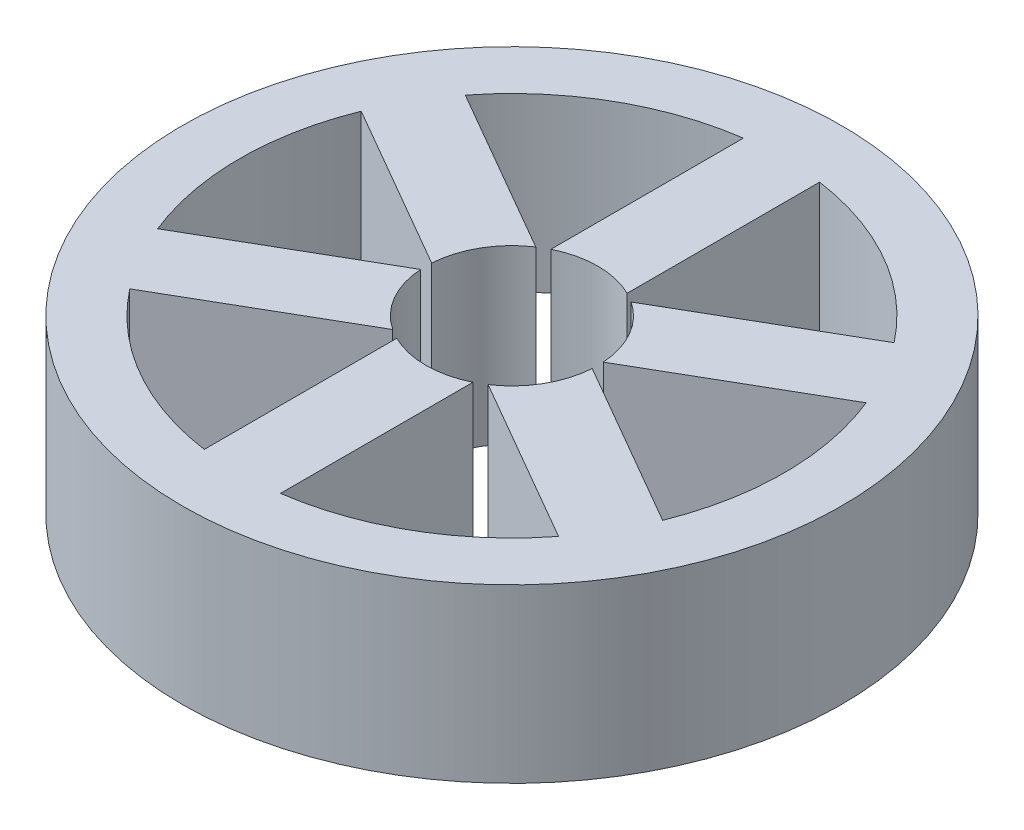
ISO-10303-21;
HEADER;
FILE_DESCRIPTION(('STEP AP214'),'2;1');
FILE_NAME('part.step','',(''),(''),'','','');
FILE_SCHEMA(('AUTOMOTIVE_DESIGN { 1 0 10303 214 1 1 1 1 }'));
ENDSEC;
DATA;
#1=APPLICATION_CONTEXT('core data for automotive mechanical design processes');
#2=APPLICATION_PROTOCOL_DEFINITION('international standard','automotive_design',2000,#1);
#3=PRODUCT_CONTEXT('',#1,'mechanical');
#4=PRODUCT('Part','Part','',(#3));
#5=PRODUCT_RELATED_PRODUCT_CATEGORY('part','',(#4));
#6=PRODUCT_DEFINITION_FORMATION('','',#4);
#7=PRODUCT_DEFINITION_CONTEXT('part definition',#1,'design');
#8=PRODUCT_DEFINITION('design','',#6,#7);
#9=PRODUCT_DEFINITION_SHAPE('','',#8);
#10=(LENGTH_UNIT() NAMED_UNIT(*) SI_UNIT(.MILLI.,.METRE.));
#11=(NAMED_UNIT(*) PLANE_ANGLE_UNIT() SI_UNIT($,.RADIAN.));
#12=(NAMED_UNIT(*) SI_UNIT($,.STERADIAN.) SOLID_ANGLE_UNIT());
#13=UNCERTAINTY_MEASURE_WITH_UNIT(LENGTH_MEASURE(1.E-05),#10,'distance_accuracy_value','');
#14=(GEOMETRIC_REPRESENTATION_CONTEXT(3) GLOBAL_UNCERTAINTY_ASSIGNED_CONTEXT((#13)) GLOBAL_UNIT_ASSIGNED_CONTEXT((#10,
#11,#12)) REPRESENTATION_CONTEXT('',''));
#15=CARTESIAN_POINT('',(0.,0.,0.));
#16=DIRECTION('',(0.,0.,1.));
#17=DIRECTION('',(1.,0.,0.));
#18=AXIS2_PLACEMENT_3D('',#15,#16,#17);
#19=CARTESIAN_POINT('',(0.,3.,0.));
#20=DIRECTION('',(0.,-1.,0.));
#21=DIRECTION('',(0.,0.,-1.));
#22=AXIS2_PLACEMENT_3D('',#19,#20,#21);
#23=CYLINDRICAL_SURFACE('',#22,4.75);
#24=CARTESIAN_POINT('',(0.,0.,0.));
#25=DIRECTION('',(0.,1.,0.));
#26=DIRECTION('',(0.,0.,1.));
#27=AXIS2_PLACEMENT_3D('',#24,#25,#26);
#28=CIRCLE('',#27,4.75);
#29=CARTESIAN_POINT('',(-3.74081986253042,0.,2.92724559203664));
#30=VERTEX_POINT('',#29);
#31=CARTESIAN_POINT('',(-0.664659114554616,0.,4.70326782795106));
#32=VERTEX_POINT('',#31);
#33=EDGE_CURVE('E313',#30,#32,#28,.T.);
#34=ORIENTED_EDGE('',*,*,#33,.F.);
#35=DIRECTION('',(0.,-1.,0.));
#36=VECTOR('',#35,1.);
#37=CARTESIAN_POINT('',(-3.74081986253042,3.,2.92724559203664));
#38=LINE('',#37,#36);
#39=CARTESIAN_POINT('',(-3.74081986253042,3.,2.92724559203664));
#40=VERTEX_POINT('',#39);
#41=EDGE_CURVE('E11',#40,#30,#38,.T.);
#42=ORIENTED_EDGE('',*,*,#41,.F.);
#43=CARTESIAN_POINT('',(0.,3.,0.));
#44=DIRECTION('',(0.,1.,0.));
#45=DIRECTION('',(0.,0.,1.));
#46=AXIS2_PLACEMENT_3D('',#43,#44,#45);
#47=CIRCLE('',#46,4.75);
#48=CARTESIAN_POINT('',(-0.664659114554616,3.,4.70326782795106));
#49=VERTEX_POINT('',#48);
#50=EDGE_CURVE('E256',#40,#49,#47,.T.);
#51=ORIENTED_EDGE('',*,*,#50,.T.);
#52=DIRECTION('',(0.,-1.,0.));
#53=VECTOR('',#52,1.);
#54=CARTESIAN_POINT('',(-0.664659114554616,3.,4.70326782795106));
#55=LINE('',#54,#53);
#56=EDGE_CURVE('E142',#49,#32,#55,.T.);
#57=ORIENTED_EDGE('',*,*,#56,.T.);
#58=EDGE_LOOP('',(#34,#42,#51,#57));
#59=FACE_BOUND('',#58,.T.);
#60=ADVANCED_FACE('F43',(#59),#23,.F.);
#61=CARTESIAN_POINT('',(0.332329557277286,3.,0.575611678061143));
#62=DIRECTION('',(0.499999999999992,0.,0.866025403784443));
#63=DIRECTION('',(0.866025403784443,0.,-0.499999999999992));
#64=AXIS2_PLACEMENT_3D('',#61,#62,#63);
#65=PLANE('',#64);
#66=DIRECTION('',(-0.866025403784443,0.,0.499999999999992));
#67=VECTOR('',#66,1.);
#68=CARTESIAN_POINT('',(0.332329557277286,0.,0.575611678061143));
#69=LINE('',#68,#67);
#70=CARTESIAN_POINT('',(-0.832218078536575,0.,1.2479635690824));
#71=VERTEX_POINT('',#70);
#72=EDGE_CURVE('E317',#71,#30,#69,.T.);
#73=ORIENTED_EDGE('',*,*,#72,.F.);
#74=DIRECTION('',(0.,-1.,0.));
#75=VECTOR('',#74,1.);
#76=CARTESIAN_POINT('',(-0.832218078536575,3.,1.2479635690824));
#77=LINE('',#76,#75);
#78=CARTESIAN_POINT('',(-0.832218078536575,3.,1.2479635690824));
#79=VERTEX_POINT('',#78);
#80=EDGE_CURVE('E52',#79,#71,#77,.T.);
#81=ORIENTED_EDGE('',*,*,#80,.F.);
#82=DIRECTION('',(-0.866025403784443,0.,0.499999999999992));
#83=VECTOR('',#82,1.);
#84=CARTESIAN_POINT('',(0.332329557277286,3.,0.575611678061143));
#85=LINE('',#84,#83);
#86=EDGE_CURVE('E248',#79,#40,#85,.T.);
#87=ORIENTED_EDGE('',*,*,#86,.T.);
#88=ORIENTED_EDGE('',*,*,#41,.T.);
#89=EDGE_LOOP('',(#73,#81,#87,#88));
#90=FACE_BOUND('',#89,.T.);
#91=ADVANCED_FACE('F460',(#90),#65,.T.);
#92=CARTESIAN_POINT('',(0.,3.,0.));
#93=DIRECTION('',(0.,-1.,0.));
#94=DIRECTION('',(0.,0.,-1.));
#95=AXIS2_PLACEMENT_3D('',#92,#93,#94);
#96=CYLINDRICAL_SURFACE('',#95,1.5);
#97=CARTESIAN_POINT('',(0.,0.,0.));
#98=DIRECTION('',(0.,1.,0.));
#99=DIRECTION('',(0.,0.,1.));
#100=AXIS2_PLACEMENT_3D('',#97,#98,#99);
#101=CIRCLE('',#100,1.5);
#102=CARTESIAN_POINT('',(-1.49687719309115,0.,0.0967402129601177));
#103=VERTEX_POINT('',#102);
#104=EDGE_CURVE('E321',#103,#71,#101,.T.);
#105=ORIENTED_EDGE('',*,*,#104,.F.);
#106=DIRECTION('',(0.,-1.,0.));
#107=VECTOR('',#106,1.);
#108=CARTESIAN_POINT('',(-1.49687719309115,3.,0.0967402129601177));
#109=LINE('',#108,#107);
#110=CARTESIAN_POINT('',(-1.49687719309115,3.,0.0967402129601177));
#111=VERTEX_POINT('',#110);
#112=EDGE_CURVE('E452',#111,#103,#109,.T.);
#113=ORIENTED_EDGE('',*,*,#112,.F.);
#114=CARTESIAN_POINT('',(0.,3.,0.));
#115=DIRECTION('',(0.,1.,0.));
#116=DIRECTION('',(0.,0.,1.));
#117=AXIS2_PLACEMENT_3D('',#114,#115,#116);
#118=CIRCLE('',#117,1.5);
#119=EDGE_CURVE('E234',#111,#79,#118,.T.);
#120=ORIENTED_EDGE('',*,*,#119,.T.);
#121=ORIENTED_EDGE('',*,*,#80,.T.);
#122=EDGE_LOOP('',(#105,#113,#120,#121));
#123=FACE_BOUND('',#122,.T.);
#124=ADVANCED_FACE('F457',(#123),#96,.F.);
#125=CARTESIAN_POINT('',(-0.332329557277286,3.,-0.575611678061143));
#126=DIRECTION('',(0.499999999999992,0.,0.866025403784443));
#127=DIRECTION('',(0.866025403784443,0.,-0.499999999999992));
#128=AXIS2_PLACEMENT_3D('',#125,#126,#127);
#129=PLANE('',#128);
#130=DIRECTION('',(-0.866025403784443,0.,0.499999999999992));
#131=VECTOR('',#130,1.);
#132=CARTESIAN_POINT('',(-0.332329557277286,0.,-0.575611678061143));
#133=LINE('',#132,#131);
#134=CARTESIAN_POINT('',(-4.40547897708499,0.,1.77602223591435));
#135=VERTEX_POINT('',#134);
#136=EDGE_CURVE('E325',#103,#135,#133,.T.);
#137=ORIENTED_EDGE('',*,*,#136,.T.);
#138=DIRECTION('',(0.,-1.,0.));
#139=VECTOR('',#138,1.);
#140=CARTESIAN_POINT('',(-4.40547897708499,3.,1.77602223591435));
#141=LINE('',#140,#139);
#142=CARTESIAN_POINT('',(-4.40547897708499,3.,1.77602223591435));
#143=VERTEX_POINT('',#142);
#144=EDGE_CURVE('E449',#143,#135,#141,.T.);
#145=ORIENTED_EDGE('',*,*,#144,.F.);
#146=DIRECTION('',(-0.866025403784443,0.,0.499999999999992));
#147=VECTOR('',#146,1.);
#148=CARTESIAN_POINT('',(-0.332329557277286,3.,-0.575611678061143));
#149=LINE('',#148,#147);
#150=EDGE_CURVE('E247',#111,#143,#149,.T.);
#151=ORIENTED_EDGE('',*,*,#150,.F.);
#152=ORIENTED_EDGE('',*,*,#112,.T.);
#153=EDGE_LOOP('',(#137,#145,#151,#152));
#154=FACE_BOUND('',#153,.T.);
#155=ADVANCED_FACE('F468',(#154),#129,.F.);
#156=CARTESIAN_POINT('',(0.,3.,0.));
#157=DIRECTION('',(0.,-1.,0.));
#158=DIRECTION('',(0.,0.,-1.));
#159=AXIS2_PLACEMENT_3D('',#156,#157,#158);
#160=CYLINDRICAL_SURFACE('',#159,4.75);
#161=CARTESIAN_POINT('',(0.,0.,0.));
#162=DIRECTION('',(0.,1.,0.));
#163=DIRECTION('',(0.,0.,1.));
#164=AXIS2_PLACEMENT_3D('',#161,#162,#163);
#165=CIRCLE('',#164,4.75);
#166=CARTESIAN_POINT('',(-4.40547897708495,0.,-1.77602223591444));
#167=VERTEX_POINT('',#166);
#168=EDGE_CURVE('E331',#167,#135,#165,.T.);
#169=ORIENTED_EDGE('',*,*,#168,.F.);
#170=DIRECTION('',(0.,-1.,0.));
#171=VECTOR('',#170,1.);
#172=CARTESIAN_POINT('',(-4.40547897708495,3.,-1.77602223591444));
#173=LINE('',#172,#171);
#174=CARTESIAN_POINT('',(-4.40547897708495,3.,-1.77602223591444));
#175=VERTEX_POINT('',#174);
#176=EDGE_CURVE('E446',#175,#167,#173,.T.);
#177=ORIENTED_EDGE('',*,*,#176,.F.);
#178=CARTESIAN_POINT('',(0.,3.,0.));
#179=DIRECTION('',(0.,1.,0.));
#180=DIRECTION('',(0.,0.,1.));
#181=AXIS2_PLACEMENT_3D('',#178,#179,#180);
#182=CIRCLE('',#181,4.75);
#183=EDGE_CURVE('E254',#175,#143,#182,.T.);
#184=ORIENTED_EDGE('',*,*,#183,.T.);
#185=ORIENTED_EDGE('',*,*,#144,.T.);
#186=EDGE_LOOP('',(#169,#177,#184,#185));
#187=FACE_BOUND('',#186,.T.);
#188=ADVANCED_FACE('F492',(#187),#160,.F.);
#189=CARTESIAN_POINT('',(-0.332329557277298,3.,0.575611678061136));
#190=DIRECTION('',(-0.50000000000001,0.,0.866025403784433));
#191=DIRECTION('',(0.866025403784433,0.,0.50000000000001));
#192=AXIS2_PLACEMENT_3D('',#189,#190,#191);
#193=PLANE('',#192);
#194=DIRECTION('',(-0.866025403784433,0.,-0.50000000000001));
#195=VECTOR('',#194,1.);
#196=CARTESIAN_POINT('',(-0.332329557277298,0.,0.575611678061136));
#197=LINE('',#196,#195);
#198=CARTESIAN_POINT('',(-1.49687719309115,0.,-0.0967402129601493));
#199=VERTEX_POINT('',#198);
#200=EDGE_CURVE('E335',#199,#167,#197,.T.);
#201=ORIENTED_EDGE('',*,*,#200,.F.);
#202=DIRECTION('',(0.,-1.,0.));
#203=VECTOR('',#202,1.);
#204=CARTESIAN_POINT('',(-1.49687719309115,3.,-0.0967402129601493));
#205=LINE('',#204,#203);
#206=CARTESIAN_POINT('',(-1.49687719309115,3.,-0.0967402129601493));
#207=VERTEX_POINT('',#206);
#208=EDGE_CURVE('E443',#207,#199,#205,.T.);
#209=ORIENTED_EDGE('',*,*,#208,.F.);
#210=DIRECTION('',(-0.866025403784433,0.,-0.50000000000001));
#211=VECTOR('',#210,1.);
#212=CARTESIAN_POINT('',(-0.332329557277298,3.,0.575611678061136));
#213=LINE('',#212,#211);
#214=EDGE_CURVE('E260',#207,#175,#213,.T.);
#215=ORIENTED_EDGE('',*,*,#214,.T.);
#216=ORIENTED_EDGE('',*,*,#176,.T.);
#217=EDGE_LOOP('',(#201,#209,#215,#216));
#218=FACE_BOUND('',#217,.T.);
#219=ADVANCED_FACE('F490',(#218),#193,.T.);
#220=CARTESIAN_POINT('',(-0.832218078536549,0.,-1.24796356908242));
#221=VERTEX_POINT('',#220);
#222=EDGE_CURVE('E327',#221,#199,#101,.T.);
#223=ORIENTED_EDGE('',*,*,#222,.F.);
#224=DIRECTION('',(0.,-1.,0.));
#225=VECTOR('',#224,1.);
#226=CARTESIAN_POINT('',(-0.832218078536549,3.,-1.24796356908242));
#227=LINE('',#226,#225);
#228=CARTESIAN_POINT('',(-0.832218078536549,3.,-1.24796356908242));
#229=VERTEX_POINT('',#228);
#230=EDGE_CURVE('E440',#229,#221,#227,.T.);
#231=ORIENTED_EDGE('',*,*,#230,.F.);
#232=EDGE_CURVE('E249',#229,#207,#118,.T.);
#233=ORIENTED_EDGE('',*,*,#232,.T.);
#234=ORIENTED_EDGE('',*,*,#208,.T.);
#235=EDGE_LOOP('',(#223,#231,#233,#234));
#236=FACE_BOUND('',#235,.T.);
#237=ADVANCED_FACE('F486',(#236),#96,.F.);
#238=CARTESIAN_POINT('',(0.332329557277298,3.,-0.575611678061136));
#239=DIRECTION('',(-0.50000000000001,0.,0.866025403784433));
#240=DIRECTION('',(0.866025403784433,0.,0.50000000000001));
#241=AXIS2_PLACEMENT_3D('',#238,#239,#240);
#242=PLANE('',#241);
#243=DIRECTION('',(-0.866025403784433,0.,-0.50000000000001));
#244=VECTOR('',#243,1.);
#245=CARTESIAN_POINT('',(0.332329557277298,0.,-0.575611678061136));
#246=LINE('',#245,#244);
#247=CARTESIAN_POINT('',(-3.74081986253036,0.,-2.92724559203672));
#248=VERTEX_POINT('',#247);
#249=EDGE_CURVE('E339',#221,#248,#246,.T.);
#250=ORIENTED_EDGE('',*,*,#249,.T.);
#251=DIRECTION('',(0.,-1.,0.));
#252=VECTOR('',#251,1.);
#253=CARTESIAN_POINT('',(-3.74081986253036,3.,-2.92724559203672));
#254=LINE('',#253,#252);
#255=CARTESIAN_POINT('',(-3.74081986253036,3.,-2.92724559203672));
#256=VERTEX_POINT('',#255);
#257=EDGE_CURVE('E437',#256,#248,#254,.T.);
#258=ORIENTED_EDGE('',*,*,#257,.F.);
#259=DIRECTION('',(-0.866025403784433,0.,-0.50000000000001));
#260=VECTOR('',#259,1.);
#261=CARTESIAN_POINT('',(0.332329557277298,3.,-0.575611678061136));
#262=LINE('',#261,#260);
#263=EDGE_CURVE('E259',#229,#256,#262,.T.);
#264=ORIENTED_EDGE('',*,*,#263,.F.);
#265=ORIENTED_EDGE('',*,*,#230,.T.);
#266=EDGE_LOOP('',(#250,#258,#264,#265));
#267=FACE_BOUND('',#266,.T.);
#268=ADVANCED_FACE('F571',(#267),#242,.F.);
#269=CARTESIAN_POINT('',(0.,3.,0.));
#270=DIRECTION('',(0.,-1.,0.));
#271=DIRECTION('',(0.,0.,-1.));
#272=AXIS2_PLACEMENT_3D('',#269,#270,#271);
#273=CYLINDRICAL_SURFACE('',#272,4.75);
#274=CARTESIAN_POINT('',(0.,0.,0.));
#275=DIRECTION('',(0.,1.,0.));
#276=DIRECTION('',(0.,0.,1.));
#277=AXIS2_PLACEMENT_3D('',#274,#275,#276);
#278=CIRCLE('',#277,4.75);
#279=CARTESIAN_POINT('',(-0.664659114554583,0.,-4.70326782795106));
#280=VERTEX_POINT('',#279);
#281=EDGE_CURVE('E343',#280,#248,#278,.T.);
#282=ORIENTED_EDGE('',*,*,#281,.F.);
#283=DIRECTION('',(0.,-1.,0.));
#284=VECTOR('',#283,1.);
#285=CARTESIAN_POINT('',(-0.664659114554583,3.,-4.70326782795106));
#286=LINE('',#285,#284);
#287=CARTESIAN_POINT('',(-0.664659114554583,3.,-4.70326782795106));
#288=VERTEX_POINT('',#287);
#289=EDGE_CURVE('E434',#288,#280,#286,.T.);
#290=ORIENTED_EDGE('',*,*,#289,.F.);
#291=CARTESIAN_POINT('',(0.,3.,0.));
#292=DIRECTION('',(0.,1.,0.));
#293=DIRECTION('',(0.,0.,1.));
#294=AXIS2_PLACEMENT_3D('',#291,#292,#293);
#295=CIRCLE('',#294,4.75);
#296=EDGE_CURVE('E266',#288,#256,#295,.T.);
#297=ORIENTED_EDGE('',*,*,#296,.T.);
#298=ORIENTED_EDGE('',*,*,#257,.T.);
#299=EDGE_LOOP('',(#282,#290,#297,#298));
#300=FACE_BOUND('',#299,.T.);
#301=ADVANCED_FACE('F501',(#300),#273,.F.);
#302=CARTESIAN_POINT('',(-0.664659114554583,3.,0.));
#303=DIRECTION('',(-1.,0.,0.));
#304=DIRECTION('',(0.,0.,1.));
#305=AXIS2_PLACEMENT_3D('',#302,#303,#304);
#306=PLANE('',#305);
#307=DIRECTION('',(0.,0.,-1.));
#308=VECTOR('',#307,1.);
#309=CARTESIAN_POINT('',(-0.664659114554583,0.,0.));
#310=LINE('',#309,#308);
#311=CARTESIAN_POINT('',(-0.664659114554583,0.,-1.34470378204254));
#312=VERTEX_POINT('',#311);
#313=EDGE_CURVE('E347',#312,#280,#310,.T.);
#314=ORIENTED_EDGE('',*,*,#313,.F.);
#315=DIRECTION('',(0.,-1.,0.));
#316=VECTOR('',#315,1.);
#317=CARTESIAN_POINT('',(-0.664659114554583,3.,-1.34470378204254));
#318=LINE('',#317,#316);
#319=CARTESIAN_POINT('',(-0.664659114554583,3.,-1.34470378204254));
#320=VERTEX_POINT('',#319);
#321=EDGE_CURVE('E431',#320,#312,#318,.T.);
#322=ORIENTED_EDGE('',*,*,#321,.F.);
#323=DIRECTION('',(0.,0.,-1.));
#324=VECTOR('',#323,1.);
#325=CARTESIAN_POINT('',(-0.664659114554583,3.,0.));
#326=LINE('',#325,#324);
#327=EDGE_CURVE('E273',#320,#288,#326,.T.);
#328=ORIENTED_EDGE('',*,*,#327,.T.);
#329=ORIENTED_EDGE('',*,*,#289,.T.);
#330=EDGE_LOOP('',(#314,#322,#328,#329));
#331=FACE_BOUND('',#330,.T.);
#332=ADVANCED_FACE('F506',(#331),#306,.T.);
#333=CARTESIAN_POINT('',(0.664659114554583,0.,-1.34470378204254));
#334=VERTEX_POINT('',#333);
#335=EDGE_CURVE('E351',#334,#312,#101,.T.);
#336=ORIENTED_EDGE('',*,*,#335,.F.);
#337=DIRECTION('',(0.,-1.,0.));
#338=VECTOR('',#337,1.);
#339=CARTESIAN_POINT('',(0.664659114554583,3.,-1.34470378204254));
#340=LINE('',#339,#338);
#341=CARTESIAN_POINT('',(0.664659114554583,3.,-1.34470378204254));
#342=VERTEX_POINT('',#341);
#343=EDGE_CURVE('E428',#342,#334,#340,.T.);
#344=ORIENTED_EDGE('',*,*,#343,.F.);
#345=EDGE_CURVE('E261',#342,#320,#118,.T.);
#346=ORIENTED_EDGE('',*,*,#345,.T.);
#347=ORIENTED_EDGE('',*,*,#321,.T.);
#348=EDGE_LOOP('',(#336,#344,#346,#347));
#349=FACE_BOUND('',#348,.T.);
#350=ADVANCED_FACE('F508',(#349),#96,.F.);
#351=CARTESIAN_POINT('',(0.664659114554583,3.,0.));
#352=DIRECTION('',(-1.,0.,0.));
#353=DIRECTION('',(0.,0.,1.));
#354=AXIS2_PLACEMENT_3D('',#351,#352,#353);
#355=PLANE('',#354);
#356=DIRECTION('',(0.,0.,-1.));
#357=VECTOR('',#356,1.);
#358=CARTESIAN_POINT('',(0.664659114554583,0.,0.));
#359=LINE('',#358,#357);
#360=CARTESIAN_POINT('',(0.664659114554583,0.,-4.70326782795106));
#361=VERTEX_POINT('',#360);
#362=EDGE_CURVE('E352',#334,#361,#359,.T.);
#363=ORIENTED_EDGE('',*,*,#362,.T.);
#364=DIRECTION('',(0.,-1.,0.));
#365=VECTOR('',#364,1.);
#366=CARTESIAN_POINT('',(0.664659114554583,3.,-4.70326782795106));
#367=LINE('',#366,#365);
#368=CARTESIAN_POINT('',(0.664659114554583,3.,-4.70326782795106));
#369=VERTEX_POINT('',#368);
#370=EDGE_CURVE('E425',#369,#361,#367,.T.);
#371=ORIENTED_EDGE('',*,*,#370,.F.);
#372=DIRECTION('',(0.,0.,-1.));
#373=VECTOR('',#372,1.);
#374=CARTESIAN_POINT('',(0.664659114554583,3.,0.));
#375=LINE('',#374,#373);
#376=EDGE_CURVE('E272',#342,#369,#375,.T.);
#377=ORIENTED_EDGE('',*,*,#376,.F.);
#378=ORIENTED_EDGE('',*,*,#343,.T.);
#379=EDGE_LOOP('',(#363,#371,#377,#378));
#380=FACE_BOUND('',#379,.T.);
#381=ADVANCED_FACE('F514',(#380),#355,.F.);
#382=CARTESIAN_POINT('',(0.,3.,0.));
#383=DIRECTION('',(0.,-1.,0.));
#384=DIRECTION('',(0.,0.,-1.));
#385=AXIS2_PLACEMENT_3D('',#382,#383,#384);
#386=CYLINDRICAL_SURFACE('',#385,4.75);
#387=CARTESIAN_POINT('',(0.,0.,0.));
#388=DIRECTION('',(0.,1.,0.));
#389=DIRECTION('',(0.,0.,1.));
#390=AXIS2_PLACEMENT_3D('',#387,#388,#389);
#391=CIRCLE('',#390,4.75);
#392=CARTESIAN_POINT('',(3.7408198625304,0.,-2.92724559203666));
#393=VERTEX_POINT('',#392);
#394=EDGE_CURVE('E356',#393,#361,#391,.T.);
#395=ORIENTED_EDGE('',*,*,#394,.F.);
#396=DIRECTION('',(0.,-1.,0.));
#397=VECTOR('',#396,1.);
#398=CARTESIAN_POINT('',(3.7408198625304,3.,-2.92724559203666));
#399=LINE('',#398,#397);
#400=CARTESIAN_POINT('',(3.7408198625304,3.,-2.92724559203666));
#401=VERTEX_POINT('',#400);
#402=EDGE_CURVE('E422',#401,#393,#399,.T.);
#403=ORIENTED_EDGE('',*,*,#402,.F.);
#404=CARTESIAN_POINT('',(0.,3.,0.));
#405=DIRECTION('',(0.,1.,0.));
#406=DIRECTION('',(0.,0.,1.));
#407=AXIS2_PLACEMENT_3D('',#404,#405,#406);
#408=CIRCLE('',#407,4.75);
#409=EDGE_CURVE('E278',#401,#369,#408,.T.);
#410=ORIENTED_EDGE('',*,*,#409,.T.);
#411=ORIENTED_EDGE('',*,*,#370,.T.);
#412=EDGE_LOOP('',(#395,#403,#410,#411));
#413=FACE_BOUND('',#412,.T.);
#414=ADVANCED_FACE('F517',(#413),#386,.F.);
#415=CARTESIAN_POINT('',(-0.33232955727729,3.,-0.575611678061141));
#416=DIRECTION('',(-0.499999999999998,0.,-0.86602540378444));
#417=DIRECTION('',(-0.86602540378444,0.,0.499999999999998));
#418=AXIS2_PLACEMENT_3D('',#415,#416,#417);
#419=PLANE('',#418);
#420=DIRECTION('',(0.86602540378444,0.,-0.499999999999998));
#421=VECTOR('',#420,1.);
#422=CARTESIAN_POINT('',(-0.33232955727729,0.,-0.575611678061141));
#423=LINE('',#422,#421);
#424=CARTESIAN_POINT('',(0.832218078536567,0.,-1.24796356908241));
#425=VERTEX_POINT('',#424);
#426=EDGE_CURVE('E360',#425,#393,#423,.T.);
#427=ORIENTED_EDGE('',*,*,#426,.F.);
#428=DIRECTION('',(0.,-1.,0.));
#429=VECTOR('',#428,1.);
#430=CARTESIAN_POINT('',(0.832218078536567,3.,-1.24796356908241));
#431=LINE('',#430,#429);
#432=CARTESIAN_POINT('',(0.832218078536567,3.,-1.24796356908241));
#433=VERTEX_POINT('',#432);
#434=EDGE_CURVE('E419',#433,#425,#431,.T.);
#435=ORIENTED_EDGE('',*,*,#434,.F.);
#436=DIRECTION('',(0.86602540378444,0.,-0.499999999999998));
#437=VECTOR('',#436,1.);
#438=CARTESIAN_POINT('',(-0.33232955727729,3.,-0.575611678061141));
#439=LINE('',#438,#437);
#440=EDGE_CURVE('E285',#433,#401,#439,.T.);
#441=ORIENTED_EDGE('',*,*,#440,.T.);
#442=ORIENTED_EDGE('',*,*,#402,.T.);
#443=EDGE_LOOP('',(#427,#435,#441,#442));
#444=FACE_BOUND('',#443,.T.);
#445=ADVANCED_FACE('F519',(#444),#419,.T.);
#446=CARTESIAN_POINT('',(1.49687719309115,0.,-0.0967402129601286));
#447=VERTEX_POINT('',#446);
#448=EDGE_CURVE('E364',#447,#425,#101,.T.);
#449=ORIENTED_EDGE('',*,*,#448,.F.);
#450=DIRECTION('',(0.,-1.,0.));
#451=VECTOR('',#450,1.);
#452=CARTESIAN_POINT('',(1.49687719309115,3.,-0.0967402129601286));
#453=LINE('',#452,#451);
#454=CARTESIAN_POINT('',(1.49687719309115,3.,-0.0967402129601286));
#455=VERTEX_POINT('',#454);
#456=EDGE_CURVE('E416',#455,#447,#453,.T.);
#457=ORIENTED_EDGE('',*,*,#456,.F.);
#458=EDGE_CURVE('E244',#455,#433,#118,.T.);
#459=ORIENTED_EDGE('',*,*,#458,.T.);
#460=ORIENTED_EDGE('',*,*,#434,.T.);
#461=EDGE_LOOP('',(#449,#457,#459,#460));
#462=FACE_BOUND('',#461,.T.);
#463=ADVANCED_FACE('F522',(#462),#96,.F.);
#464=CARTESIAN_POINT('',(0.33232955727729,3.,0.57561167806114));
#465=DIRECTION('',(-0.499999999999998,0.,-0.86602540378444));
#466=DIRECTION('',(-0.86602540378444,0.,0.499999999999998));
#467=AXIS2_PLACEMENT_3D('',#464,#465,#466);
#468=PLANE('',#467);
#469=DIRECTION('',(0.86602540378444,0.,-0.499999999999998));
#470=VECTOR('',#469,1.);
#471=CARTESIAN_POINT('',(0.33232955727729,0.,0.57561167806114));
#472=LINE('',#471,#470);
#473=CARTESIAN_POINT('',(4.40547897708497,0.,-1.77602223591438));
#474=VERTEX_POINT('',#473);
#475=EDGE_CURVE('E365',#447,#474,#472,.T.);
#476=ORIENTED_EDGE('',*,*,#475,.T.);
#477=DIRECTION('',(0.,-1.,0.));
#478=VECTOR('',#477,1.);
#479=CARTESIAN_POINT('',(4.40547897708497,3.,-1.77602223591438));
#480=LINE('',#479,#478);
#481=CARTESIAN_POINT('',(4.40547897708497,3.,-1.77602223591438));
#482=VERTEX_POINT('',#481);
#483=EDGE_CURVE('E413',#482,#474,#480,.T.);
#484=ORIENTED_EDGE('',*,*,#483,.F.);
#485=DIRECTION('',(0.86602540378444,0.,-0.499999999999998));
#486=VECTOR('',#485,1.);
#487=CARTESIAN_POINT('',(0.33232955727729,3.,0.57561167806114));
#488=LINE('',#487,#486);
#489=EDGE_CURVE('E284',#455,#482,#488,.T.);
#490=ORIENTED_EDGE('',*,*,#489,.F.);
#491=ORIENTED_EDGE('',*,*,#456,.T.);
#492=EDGE_LOOP('',(#476,#484,#490,#491));
#493=FACE_BOUND('',#492,.T.);
#494=ADVANCED_FACE('F526',(#493),#468,.F.);
#495=CARTESIAN_POINT('',(0.,3.,0.));
#496=DIRECTION('',(0.,-1.,0.));
#497=DIRECTION('',(0.,0.,-1.));
#498=AXIS2_PLACEMENT_3D('',#495,#496,#497);
#499=CYLINDRICAL_SURFACE('',#498,4.75);
#500=CARTESIAN_POINT('',(0.,0.,0.));
#501=DIRECTION('',(0.,1.,0.));
#502=DIRECTION('',(0.,0.,1.));
#503=AXIS2_PLACEMENT_3D('',#500,#501,#502);
#504=CIRCLE('',#503,4.75);
#505=CARTESIAN_POINT('',(4.40547897708496,0.,1.77602223591441));
#506=VERTEX_POINT('',#505);
#507=EDGE_CURVE('E369',#506,#474,#504,.T.);
#508=ORIENTED_EDGE('',*,*,#507,.F.);
#509=DIRECTION('',(0.,-1.,0.));
#510=VECTOR('',#509,1.);
#511=CARTESIAN_POINT('',(4.40547897708496,3.,1.77602223591441));
#512=LINE('',#511,#510);
#513=CARTESIAN_POINT('',(4.40547897708496,3.,1.77602223591441));
#514=VERTEX_POINT('',#513);
#515=EDGE_CURVE('E410',#514,#506,#512,.T.);
#516=ORIENTED_EDGE('',*,*,#515,.F.);
#517=CARTESIAN_POINT('',(0.,3.,0.));
#518=DIRECTION('',(0.,1.,0.));
#519=DIRECTION('',(0.,0.,1.));
#520=AXIS2_PLACEMENT_3D('',#517,#518,#519);
#521=CIRCLE('',#520,4.75);
#522=EDGE_CURVE('E290',#514,#482,#521,.T.);
#523=ORIENTED_EDGE('',*,*,#522,.T.);
#524=ORIENTED_EDGE('',*,*,#483,.T.);
#525=EDGE_LOOP('',(#508,#516,#523,#524));
#526=FACE_BOUND('',#525,.T.);
#527=ADVANCED_FACE('F587',(#526),#499,.F.);
#528=CARTESIAN_POINT('',(0.332329557277294,3.,-0.575611678061139));
#529=DIRECTION('',(0.500000000000004,0.,-0.866025403784436));
#530=DIRECTION('',(-0.866025403784436,0.,-0.500000000000004));
#531=AXIS2_PLACEMENT_3D('',#528,#529,#530);
#532=PLANE('',#531);
#533=DIRECTION('',(0.866025403784436,0.,0.500000000000004));
#534=VECTOR('',#533,1.);
#535=CARTESIAN_POINT('',(0.332329557277294,0.,-0.575611678061139));
#536=LINE('',#535,#534);
#537=CARTESIAN_POINT('',(1.49687719309115,0.,0.0967402129601382));
#538=VERTEX_POINT('',#537);
#539=EDGE_CURVE('E373',#538,#506,#536,.T.);
#540=ORIENTED_EDGE('',*,*,#539,.F.);
#541=DIRECTION('',(0.,-1.,0.));
#542=VECTOR('',#541,1.);
#543=CARTESIAN_POINT('',(1.49687719309115,3.,0.0967402129601382));
#544=LINE('',#543,#542);
#545=CARTESIAN_POINT('',(1.49687719309115,3.,0.0967402129601382));
#546=VERTEX_POINT('',#545);
#547=EDGE_CURVE('E407',#546,#538,#544,.T.);
#548=ORIENTED_EDGE('',*,*,#547,.F.);
#549=DIRECTION('',(0.866025403784436,0.,0.500000000000004));
#550=VECTOR('',#549,1.);
#551=CARTESIAN_POINT('',(0.332329557277294,3.,-0.575611678061139));
#552=LINE('',#551,#550);
#553=EDGE_CURVE('E243',#546,#514,#552,.T.);
#554=ORIENTED_EDGE('',*,*,#553,.T.);
#555=ORIENTED_EDGE('',*,*,#515,.T.);
#556=EDGE_LOOP('',(#540,#548,#554,#555));
#557=FACE_BOUND('',#556,.T.);
#558=ADVANCED_FACE('F533',(#557),#532,.T.);
#559=CARTESIAN_POINT('',(0.832218078536558,0.,1.24796356908241));
#560=VERTEX_POINT('',#559);
#561=EDGE_CURVE('E377',#560,#538,#101,.T.);
#562=ORIENTED_EDGE('',*,*,#561,.F.);
#563=DIRECTION('',(0.,-1.,0.));
#564=VECTOR('',#563,1.);
#565=CARTESIAN_POINT('',(0.832218078536558,3.,1.24796356908241));
#566=LINE('',#565,#564);
#567=CARTESIAN_POINT('',(0.832218078536558,3.,1.24796356908241));
#568=VERTEX_POINT('',#567);
#569=EDGE_CURVE('E404',#568,#560,#566,.T.);
#570=ORIENTED_EDGE('',*,*,#569,.F.);
#571=EDGE_CURVE('E233',#568,#546,#118,.T.);
#572=ORIENTED_EDGE('',*,*,#571,.T.);
#573=ORIENTED_EDGE('',*,*,#547,.T.);
#574=EDGE_LOOP('',(#562,#570,#572,#573));
#575=FACE_BOUND('',#574,.T.);
#576=ADVANCED_FACE('F537',(#575),#96,.F.);
#577=CARTESIAN_POINT('',(-0.332329557277294,3.,0.575611678061138));
#578=DIRECTION('',(0.500000000000004,0.,-0.866025403784436));
#579=DIRECTION('',(-0.866025403784436,0.,-0.500000000000004));
#580=AXIS2_PLACEMENT_3D('',#577,#578,#579);
#581=PLANE('',#580);
#582=DIRECTION('',(0.866025403784436,0.,0.500000000000004));
#583=VECTOR('',#582,1.);
#584=CARTESIAN_POINT('',(-0.332329557277294,0.,0.575611678061138));
#585=LINE('',#584,#583);
#586=CARTESIAN_POINT('',(3.74081986253037,0.,2.92724559203669));
#587=VERTEX_POINT('',#586);
#588=EDGE_CURVE('E378',#560,#587,#585,.T.);
#589=ORIENTED_EDGE('',*,*,#588,.T.);
#590=DIRECTION('',(0.,-1.,0.));
#591=VECTOR('',#590,1.);
#592=CARTESIAN_POINT('',(3.74081986253037,3.,2.92724559203669));
#593=LINE('',#592,#591);
#594=CARTESIAN_POINT('',(3.74081986253037,3.,2.92724559203669));
#595=VERTEX_POINT('',#594);
#596=EDGE_CURVE('E401',#595,#587,#593,.T.);
#597=ORIENTED_EDGE('',*,*,#596,.F.);
#598=DIRECTION('',(0.866025403784436,0.,0.500000000000004));
#599=VECTOR('',#598,1.);
#600=CARTESIAN_POINT('',(-0.332329557277294,3.,0.575611678061138));
#601=LINE('',#600,#599);
#602=EDGE_CURVE('E242',#568,#595,#601,.T.);
#603=ORIENTED_EDGE('',*,*,#602,.F.);
#604=ORIENTED_EDGE('',*,*,#569,.T.);
#605=EDGE_LOOP('',(#589,#597,#603,#604));
#606=FACE_BOUND('',#605,.T.);
#607=ADVANCED_FACE('F541',(#606),#581,.F.);
#608=CARTESIAN_POINT('',(0.,3.,0.));
#609=DIRECTION('',(0.,-1.,0.));
#610=DIRECTION('',(0.,0.,-1.));
#611=AXIS2_PLACEMENT_3D('',#608,#609,#610);
#612=CYLINDRICAL_SURFACE('',#611,4.75);
#613=CARTESIAN_POINT('',(0.,0.,0.));
#614=DIRECTION('',(0.,1.,0.));
#615=DIRECTION('',(0.,0.,1.));
#616=AXIS2_PLACEMENT_3D('',#613,#614,#615);
#617=CIRCLE('',#616,4.75);
#618=CARTESIAN_POINT('',(0.66465911455455,0.,4.70326782795107));
#619=VERTEX_POINT('',#618);
#620=EDGE_CURVE('E382',#619,#587,#617,.T.);
#621=ORIENTED_EDGE('',*,*,#620,.F.);
#622=DIRECTION('',(0.,-1.,0.));
#623=VECTOR('',#622,1.);
#624=CARTESIAN_POINT('',(0.66465911455455,3.,4.70326782795107));
#625=LINE('',#624,#623);
#626=CARTESIAN_POINT('',(0.66465911455455,3.,4.70326782795107));
#627=VERTEX_POINT('',#626);
#628=EDGE_CURVE('E220',#627,#619,#625,.T.);
#629=ORIENTED_EDGE('',*,*,#628,.F.);
#630=CARTESIAN_POINT('',(0.,3.,0.));
#631=DIRECTION('',(0.,1.,0.));
#632=DIRECTION('',(0.,0.,1.));
#633=AXIS2_PLACEMENT_3D('',#630,#631,#632);
#634=CIRCLE('',#633,4.75);
#635=EDGE_CURVE('E227',#627,#595,#634,.T.);
#636=ORIENTED_EDGE('',*,*,#635,.T.);
#637=ORIENTED_EDGE('',*,*,#596,.T.);
#638=EDGE_LOOP('',(#621,#629,#636,#637));
#639=FACE_BOUND('',#638,.T.);
#640=ADVANCED_FACE('F545',(#639),#612,.F.);
#641=CARTESIAN_POINT('',(0.664659114554583,3.,0.));
#642=DIRECTION('',(1.,0.,0.));
#643=DIRECTION('',(0.,0.,-1.));
#644=AXIS2_PLACEMENT_3D('',#641,#642,#643);
#645=PLANE('',#644);
#646=DIRECTION('',(0.,0.,1.));
#647=VECTOR('',#646,1.);
#648=CARTESIAN_POINT('',(0.664659114554583,0.,0.));
#649=LINE('',#648,#647);
#650=CARTESIAN_POINT('',(0.664659114554574,0.,1.34470378204255));
#651=VERTEX_POINT('',#650);
#652=EDGE_CURVE('E214',#651,#619,#649,.T.);
#653=ORIENTED_EDGE('',*,*,#652,.F.);
#654=DIRECTION('',(0.,-1.,0.));
#655=VECTOR('',#654,1.);
#656=CARTESIAN_POINT('',(0.664659114554574,3.,1.34470378204255));
#657=LINE('',#656,#655);
#658=CARTESIAN_POINT('',(0.664659114554574,3.,1.34470378204255));
#659=VERTEX_POINT('',#658);
#660=EDGE_CURVE('E209',#659,#651,#657,.T.);
#661=ORIENTED_EDGE('',*,*,#660,.F.);
#662=DIRECTION('',(0.,0.,1.));
#663=VECTOR('',#662,1.);
#664=CARTESIAN_POINT('',(0.664659114554583,3.,0.));
#665=LINE('',#664,#663);
#666=EDGE_CURVE('E212',#659,#627,#665,.T.);
#667=ORIENTED_EDGE('',*,*,#666,.T.);
#668=ORIENTED_EDGE('',*,*,#628,.T.);
#669=EDGE_LOOP('',(#653,#661,#667,#668));
#670=FACE_BOUND('',#669,.T.);
#671=ADVANCED_FACE('F211',(#670),#645,.T.);
#672=CARTESIAN_POINT('',(-0.664659114554592,0.,1.34470378204254));
#673=VERTEX_POINT('',#672);
#674=EDGE_CURVE('E326',#673,#651,#101,.T.);
#675=ORIENTED_EDGE('',*,*,#674,.F.);
#676=DIRECTION('',(0.,-1.,0.));
#677=VECTOR('',#676,1.);
#678=CARTESIAN_POINT('',(-0.664659114554592,3.,1.34470378204254));
#679=LINE('',#678,#677);
#680=CARTESIAN_POINT('',(-0.664659114554592,3.,1.34470378204254));
#681=VERTEX_POINT('',#680);
#682=EDGE_CURVE('E135',#681,#673,#679,.T.);
#683=ORIENTED_EDGE('',*,*,#682,.F.);
#684=EDGE_CURVE('E225',#681,#659,#118,.T.);
#685=ORIENTED_EDGE('',*,*,#684,.T.);
#686=ORIENTED_EDGE('',*,*,#660,.T.);
#687=EDGE_LOOP('',(#675,#683,#685,#686));
#688=FACE_BOUND('',#687,.T.);
#689=ADVANCED_FACE('F230',(#688),#96,.F.);
#690=CARTESIAN_POINT('',(-0.664659114554583,3.,0.));
#691=DIRECTION('',(1.,0.,0.));
#692=DIRECTION('',(0.,0.,-1.));
#693=AXIS2_PLACEMENT_3D('',#690,#691,#692);
#694=PLANE('',#693);
#695=DIRECTION('',(0.,0.,1.));
#696=VECTOR('',#695,1.);
#697=CARTESIAN_POINT('',(-0.664659114554583,0.,0.));
#698=LINE('',#697,#696);
#699=EDGE_CURVE('E388',#673,#32,#698,.T.);
#700=ORIENTED_EDGE('',*,*,#699,.T.);
#701=ORIENTED_EDGE('',*,*,#56,.F.);
#702=DIRECTION('',(0.,0.,1.));
#703=VECTOR('',#702,1.);
#704=CARTESIAN_POINT('',(-0.664659114554583,3.,0.));
#705=LINE('',#704,#703);
#706=EDGE_CURVE('E60',#681,#49,#705,.T.);
#707=ORIENTED_EDGE('',*,*,#706,.F.);
#708=ORIENTED_EDGE('',*,*,#682,.T.);
#709=EDGE_LOOP('',(#700,#701,#707,#708));
#710=FACE_BOUND('',#709,.T.);
#711=ADVANCED_FACE('F546',(#710),#694,.F.);
#712=CARTESIAN_POINT('',(0.,3.,0.));
#713=DIRECTION('',(0.,-1.,0.));
#714=DIRECTION('',(0.,0.,-1.));
#715=AXIS2_PLACEMENT_3D('',#712,#713,#714);
#716=CYLINDRICAL_SURFACE('',#715,5.75);
#717=CARTESIAN_POINT('',(0.,3.,0.));
#718=DIRECTION('',(0.,1.,0.));
#719=DIRECTION('',(0.,0.,1.));
#720=AXIS2_PLACEMENT_3D('',#717,#718,#719);
#721=CIRCLE('',#720,5.75);
#722=CARTESIAN_POINT('',(0.,3.,5.75));
#723=VERTEX_POINT('',#722);
#724=EDGE_CURVE('E236',#723,#723,#721,.T.);
#725=ORIENTED_EDGE('',*,*,#724,.F.);
#726=EDGE_LOOP('',(#725));
#727=FACE_BOUND('',#726,.T.);
#728=CARTESIAN_POINT('',(0.,0.,0.));
#729=DIRECTION('',(0.,1.,0.));
#730=DIRECTION('',(0.,0.,1.));
#731=AXIS2_PLACEMENT_3D('',#728,#729,#730);
#732=CIRCLE('',#731,5.75);
#733=CARTESIAN_POINT('',(0.,0.,5.75));
#734=VERTEX_POINT('',#733);
#735=EDGE_CURVE('E391',#734,#734,#732,.T.);
#736=ORIENTED_EDGE('',*,*,#735,.T.);
#737=EDGE_LOOP('',(#736));
#738=FACE_BOUND('',#737,.T.);
#739=ADVANCED_FACE('F548',(#727,#738),#716,.T.);
#740=CARTESIAN_POINT('',(0.,3.,0.));
#741=DIRECTION('',(0.,1.,0.));
#742=DIRECTION('',(0.,0.,1.));
#743=AXIS2_PLACEMENT_3D('',#740,#741,#742);
#744=PLANE('',#743);
#745=ORIENTED_EDGE('',*,*,#50,.F.);
#746=ORIENTED_EDGE('',*,*,#86,.F.);
#747=ORIENTED_EDGE('',*,*,#119,.F.);
#748=ORIENTED_EDGE('',*,*,#150,.T.);
#749=ORIENTED_EDGE('',*,*,#183,.F.);
#750=ORIENTED_EDGE('',*,*,#214,.F.);
#751=ORIENTED_EDGE('',*,*,#232,.F.);
#752=ORIENTED_EDGE('',*,*,#263,.T.);
#753=ORIENTED_EDGE('',*,*,#296,.F.);
#754=ORIENTED_EDGE('',*,*,#327,.F.);
#755=ORIENTED_EDGE('',*,*,#345,.F.);
#756=ORIENTED_EDGE('',*,*,#376,.T.);
#757=ORIENTED_EDGE('',*,*,#409,.F.);
#758=ORIENTED_EDGE('',*,*,#440,.F.);
#759=ORIENTED_EDGE('',*,*,#458,.F.);
#760=ORIENTED_EDGE('',*,*,#489,.T.);
#761=ORIENTED_EDGE('',*,*,#522,.F.);
#762=ORIENTED_EDGE('',*,*,#553,.F.);
#763=ORIENTED_EDGE('',*,*,#571,.F.);
#764=ORIENTED_EDGE('',*,*,#602,.T.);
#765=ORIENTED_EDGE('',*,*,#635,.F.);
#766=ORIENTED_EDGE('',*,*,#666,.F.);
#767=ORIENTED_EDGE('',*,*,#684,.F.);
#768=ORIENTED_EDGE('',*,*,#706,.T.);
#769=EDGE_LOOP('',(#745,#746,#747,#748,#749,#750,#751,#752,#753,#754,#755,#756,#757,#758,#759,
#760,#761,#762,#763,#764,#765,#766,#767,#768));
#770=FACE_BOUND('',#769,.T.);
#771=ORIENTED_EDGE('',*,*,#724,.T.);
#772=EDGE_LOOP('',(#771));
#773=FACE_BOUND('',#772,.T.);
#774=ADVANCED_FACE('F223',(#770,#773),#744,.T.);
#775=CARTESIAN_POINT('',(0.,0.,0.));
#776=DIRECTION('',(0.,1.,0.));
#777=DIRECTION('',(0.,0.,1.));
#778=AXIS2_PLACEMENT_3D('',#775,#776,#777);
#779=PLANE('',#778);
#780=ORIENTED_EDGE('',*,*,#33,.T.);
#781=ORIENTED_EDGE('',*,*,#699,.F.);
#782=ORIENTED_EDGE('',*,*,#674,.T.);
#783=ORIENTED_EDGE('',*,*,#652,.T.);
#784=ORIENTED_EDGE('',*,*,#620,.T.);
#785=ORIENTED_EDGE('',*,*,#588,.F.);
#786=ORIENTED_EDGE('',*,*,#561,.T.);
#787=ORIENTED_EDGE('',*,*,#539,.T.);
#788=ORIENTED_EDGE('',*,*,#507,.T.);
#789=ORIENTED_EDGE('',*,*,#475,.F.);
#790=ORIENTED_EDGE('',*,*,#448,.T.);
#791=ORIENTED_EDGE('',*,*,#426,.T.);
#792=ORIENTED_EDGE('',*,*,#394,.T.);
#793=ORIENTED_EDGE('',*,*,#362,.F.);
#794=ORIENTED_EDGE('',*,*,#335,.T.);
#795=ORIENTED_EDGE('',*,*,#313,.T.);
#796=ORIENTED_EDGE('',*,*,#281,.T.);
#797=ORIENTED_EDGE('',*,*,#249,.F.);
#798=ORIENTED_EDGE('',*,*,#222,.T.);
#799=ORIENTED_EDGE('',*,*,#200,.T.);
#800=ORIENTED_EDGE('',*,*,#168,.T.);
#801=ORIENTED_EDGE('',*,*,#136,.F.);
#802=ORIENTED_EDGE('',*,*,#104,.T.);
#803=ORIENTED_EDGE('',*,*,#72,.T.);
#804=EDGE_LOOP('',(#780,#781,#782,#783,#784,#785,#786,#787,#788,#789,#790,#791,#792,#793,#794,
#795,#796,#797,#798,#799,#800,#801,#802,#803));
#805=FACE_BOUND('',#804,.T.);
#806=ORIENTED_EDGE('',*,*,#735,.F.);
#807=EDGE_LOOP('',(#806));
#808=FACE_BOUND('',#807,.T.);
#809=ADVANCED_FACE('F463',(#805,#808),#779,.F.);
#810=CLOSED_SHELL('',(#60,#91,#124,#155,#188,#219,#237,#268,#301,#332,#350,#381,#414,#445,#463,
#494,#527,#558,#576,#607,#640,#671,#689,#711,#739,#774,#809));
#811=MANIFOLD_SOLID_BREP('B2',#810);
#812=ADVANCED_BREP_SHAPE_REPRESENTATION('',(#18,#811),#14);
#813=SHAPE_DEFINITION_REPRESENTATION(#9,#812);
ENDSEC;
END-ISO-10303-21;
